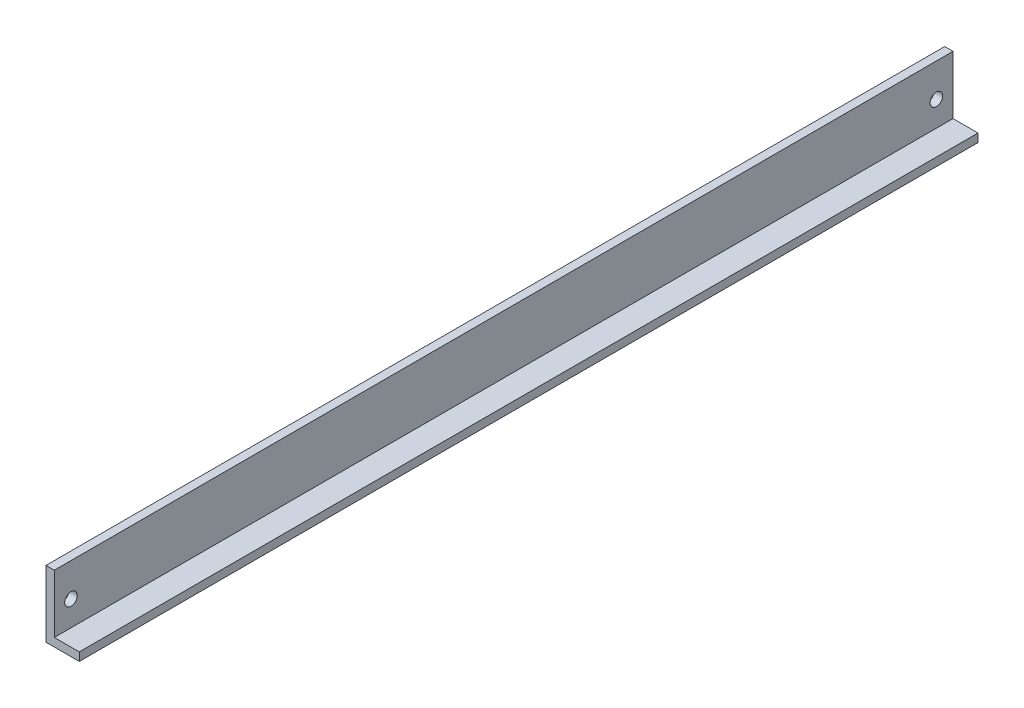
ISO-10303-21;
HEADER;
FILE_DESCRIPTION(('STEP AP214'),'2;1');
FILE_NAME('part.step','',(''),(''),'','','');
FILE_SCHEMA(('AUTOMOTIVE_DESIGN { 1 0 10303 214 1 1 1 1 }'));
ENDSEC;
DATA;
#1=APPLICATION_CONTEXT('core data for automotive mechanical design processes');
#2=APPLICATION_PROTOCOL_DEFINITION('international standard','automotive_design',2000,#1);
#3=PRODUCT_CONTEXT('',#1,'mechanical');
#4=PRODUCT('Part','Part','',(#3));
#5=PRODUCT_RELATED_PRODUCT_CATEGORY('part','',(#4));
#6=PRODUCT_DEFINITION_FORMATION('','',#4);
#7=PRODUCT_DEFINITION_CONTEXT('part definition',#1,'design');
#8=PRODUCT_DEFINITION('design','',#6,#7);
#9=PRODUCT_DEFINITION_SHAPE('','',#8);
#10=(LENGTH_UNIT() NAMED_UNIT(*) SI_UNIT(.MILLI.,.METRE.));
#11=(NAMED_UNIT(*) PLANE_ANGLE_UNIT() SI_UNIT($,.RADIAN.));
#12=(NAMED_UNIT(*) SI_UNIT($,.STERADIAN.) SOLID_ANGLE_UNIT());
#13=UNCERTAINTY_MEASURE_WITH_UNIT(LENGTH_MEASURE(1.E-05),#10,'distance_accuracy_value','');
#14=(GEOMETRIC_REPRESENTATION_CONTEXT(3) GLOBAL_UNCERTAINTY_ASSIGNED_CONTEXT((#13)) GLOBAL_UNIT_ASSIGNED_CONTEXT((#10,
#11,#12)) REPRESENTATION_CONTEXT('',''));
#15=CARTESIAN_POINT('',(0.,0.,0.));
#16=DIRECTION('',(0.,0.,1.));
#17=DIRECTION('',(1.,0.,0.));
#18=AXIS2_PLACEMENT_3D('',#15,#16,#17);
#19=CARTESIAN_POINT('',(3.175,25.4,342.9));
#20=DIRECTION('',(-1.,0.,0.));
#21=DIRECTION('',(0.,-1.,0.));
#22=AXIS2_PLACEMENT_3D('',#19,#20,#21);
#23=PLANE('',#22);
#24=DIRECTION('',(0.,0.,1.));
#25=VECTOR('',#24,1.);
#26=CARTESIAN_POINT('',(3.175,25.4,342.9));
#27=LINE('',#26,#25);
#28=CARTESIAN_POINT('',(3.175,25.4,0.));
#29=VERTEX_POINT('',#28);
#30=CARTESIAN_POINT('',(3.175,25.4,342.9));
#31=VERTEX_POINT('',#30);
#32=EDGE_CURVE('E74',#29,#31,#27,.T.);
#33=ORIENTED_EDGE('',*,*,#32,.T.);
#34=DIRECTION('',(0.,1.,0.));
#35=VECTOR('',#34,1.);
#36=CARTESIAN_POINT('',(3.175,0.,342.9));
#37=LINE('',#36,#35);
#38=CARTESIAN_POINT('',(3.175,3.175,342.9));
#39=VERTEX_POINT('',#38);
#40=EDGE_CURVE('E77',#31,#39,#37,.F.);
#41=ORIENTED_EDGE('',*,*,#40,.T.);
#42=DIRECTION('',(0.,0.,-1.));
#43=VECTOR('',#42,1.);
#44=CARTESIAN_POINT('',(3.175,3.175,342.9));
#45=LINE('',#44,#43);
#46=CARTESIAN_POINT('',(3.175,3.175,0.));
#47=VERTEX_POINT('',#46);
#48=EDGE_CURVE('E68',#39,#47,#45,.T.);
#49=ORIENTED_EDGE('',*,*,#48,.T.);
#50=DIRECTION('',(0.,1.,0.));
#51=VECTOR('',#50,1.);
#52=CARTESIAN_POINT('',(3.175,0.,0.));
#53=LINE('',#52,#51);
#54=EDGE_CURVE('E78',#29,#47,#53,.F.);
#55=ORIENTED_EDGE('',*,*,#54,.F.);
#56=EDGE_LOOP('',(#33,#41,#49,#55));
#57=FACE_BOUND('',#56,.T.);
#58=CARTESIAN_POINT('',(3.17499999999998,12.7,6.35000000000002));
#59=DIRECTION('',(-1.,0.,0.));
#60=DIRECTION('',(0.,-1.,0.));
#61=AXIS2_PLACEMENT_3D('',#58,#59,#60);
#62=CIRCLE('',#61,2.4003);
#63=CARTESIAN_POINT('',(3.17499999999998,10.2997,6.35000000000002));
#64=VERTEX_POINT('',#63);
#65=EDGE_CURVE('E84',#64,#64,#62,.T.);
#66=ORIENTED_EDGE('',*,*,#65,.T.);
#67=EDGE_LOOP('',(#66));
#68=FACE_BOUND('',#67,.T.);
#69=CARTESIAN_POINT('',(3.17499999999998,12.7,336.55));
#70=DIRECTION('',(-1.,0.,0.));
#71=DIRECTION('',(0.,-1.,0.));
#72=AXIS2_PLACEMENT_3D('',#69,#70,#71);
#73=CIRCLE('',#72,2.40030000000002);
#74=CARTESIAN_POINT('',(3.17499999999998,10.2997,336.55));
#75=VERTEX_POINT('',#74);
#76=EDGE_CURVE('E20',#75,#75,#73,.T.);
#77=ORIENTED_EDGE('',*,*,#76,.T.);
#78=EDGE_LOOP('',(#77));
#79=FACE_BOUND('',#78,.T.);
#80=ADVANCED_FACE('F17',(#57,#68,#79),#23,.F.);
#81=CARTESIAN_POINT('',(3.175,3.175,342.9));
#82=DIRECTION('',(0.,-1.,0.));
#83=DIRECTION('',(0.,0.,-1.));
#84=AXIS2_PLACEMENT_3D('',#81,#82,#83);
#85=PLANE('',#84);
#86=ORIENTED_EDGE('',*,*,#48,.F.);
#87=DIRECTION('',(-1.,0.,0.));
#88=VECTOR('',#87,1.);
#89=CARTESIAN_POINT('',(0.,3.175,342.9));
#90=LINE('',#89,#88);
#91=CARTESIAN_POINT('',(12.7,3.175,342.9));
#92=VERTEX_POINT('',#91);
#93=EDGE_CURVE('E91',#39,#92,#90,.F.);
#94=ORIENTED_EDGE('',*,*,#93,.T.);
#95=DIRECTION('',(0.,0.,1.));
#96=VECTOR('',#95,1.);
#97=CARTESIAN_POINT('',(12.7,3.175,342.9));
#98=LINE('',#97,#96);
#99=CARTESIAN_POINT('',(12.7,3.175,0.));
#100=VERTEX_POINT('',#99);
#101=EDGE_CURVE('E99',#92,#100,#98,.F.);
#102=ORIENTED_EDGE('',*,*,#101,.T.);
#103=DIRECTION('',(-1.,0.,0.));
#104=VECTOR('',#103,1.);
#105=CARTESIAN_POINT('',(0.,3.175,0.));
#106=LINE('',#105,#104);
#107=EDGE_CURVE('E231',#47,#100,#106,.F.);
#108=ORIENTED_EDGE('',*,*,#107,.F.);
#109=EDGE_LOOP('',(#86,#94,#102,#108));
#110=FACE_BOUND('',#109,.T.);
#111=ADVANCED_FACE('F148',(#110),#85,.F.);
#112=CARTESIAN_POINT('',(12.7,3.175,342.9));
#113=DIRECTION('',(-1.,0.,0.));
#114=DIRECTION('',(0.,0.,1.));
#115=AXIS2_PLACEMENT_3D('',#112,#113,#114);
#116=PLANE('',#115);
#117=ORIENTED_EDGE('',*,*,#101,.F.);
#118=DIRECTION('',(0.,1.,0.));
#119=VECTOR('',#118,1.);
#120=CARTESIAN_POINT('',(12.7,0.,342.9));
#121=LINE('',#120,#119);
#122=CARTESIAN_POINT('',(12.7,0.,342.9));
#123=VERTEX_POINT('',#122);
#124=EDGE_CURVE('E218',#92,#123,#121,.F.);
#125=ORIENTED_EDGE('',*,*,#124,.T.);
#126=DIRECTION('',(0.,0.,1.));
#127=VECTOR('',#126,1.);
#128=CARTESIAN_POINT('',(12.7,0.,342.9));
#129=LINE('',#128,#127);
#130=CARTESIAN_POINT('',(12.7,0.,0.));
#131=VERTEX_POINT('',#130);
#132=EDGE_CURVE('E225',#123,#131,#129,.F.);
#133=ORIENTED_EDGE('',*,*,#132,.T.);
#134=DIRECTION('',(0.,1.,0.));
#135=VECTOR('',#134,1.);
#136=CARTESIAN_POINT('',(12.7,0.,0.));
#137=LINE('',#136,#135);
#138=EDGE_CURVE('E108',#100,#131,#137,.F.);
#139=ORIENTED_EDGE('',*,*,#138,.F.);
#140=EDGE_LOOP('',(#117,#125,#133,#139));
#141=FACE_BOUND('',#140,.T.);
#142=ADVANCED_FACE('F119',(#141),#116,.F.);
#143=CARTESIAN_POINT('',(330.2,12.7000000000001,336.55));
#144=DIRECTION('',(-1.,0.,0.));
#145=DIRECTION('',(0.,-1.,0.));
#146=AXIS2_PLACEMENT_3D('',#143,#144,#145);
#147=CYLINDRICAL_SURFACE('',#146,2.40030000000002);
#148=ORIENTED_EDGE('',*,*,#76,.F.);
#149=EDGE_LOOP('',(#148));
#150=FACE_BOUND('',#149,.T.);
#151=CARTESIAN_POINT('',(0.,12.7,336.55));
#152=DIRECTION('',(-1.,0.,0.));
#153=DIRECTION('',(0.,-1.,0.));
#154=AXIS2_PLACEMENT_3D('',#151,#152,#153);
#155=CIRCLE('',#154,2.40030000000002);
#156=CARTESIAN_POINT('',(0.,10.2997,336.55));
#157=VERTEX_POINT('',#156);
#158=EDGE_CURVE('E106',#157,#157,#155,.T.);
#159=ORIENTED_EDGE('',*,*,#158,.T.);
#160=EDGE_LOOP('',(#159));
#161=FACE_BOUND('',#160,.T.);
#162=ADVANCED_FACE('F115',(#150,#161),#147,.F.);
#163=CARTESIAN_POINT('',(330.2,12.7000000000001,6.35000000000002));
#164=DIRECTION('',(-1.,0.,0.));
#165=DIRECTION('',(0.,-1.,0.));
#166=AXIS2_PLACEMENT_3D('',#163,#164,#165);
#167=CYLINDRICAL_SURFACE('',#166,2.4003);
#168=ORIENTED_EDGE('',*,*,#65,.F.);
#169=EDGE_LOOP('',(#168));
#170=FACE_BOUND('',#169,.T.);
#171=CARTESIAN_POINT('',(0.,12.7,6.35000000000002));
#172=DIRECTION('',(-1.,0.,0.));
#173=DIRECTION('',(0.,-1.,0.));
#174=AXIS2_PLACEMENT_3D('',#171,#172,#173);
#175=CIRCLE('',#174,2.4003);
#176=CARTESIAN_POINT('',(0.,10.2997,6.35000000000002));
#177=VERTEX_POINT('',#176);
#178=EDGE_CURVE('E103',#177,#177,#175,.T.);
#179=ORIENTED_EDGE('',*,*,#178,.T.);
#180=EDGE_LOOP('',(#179));
#181=FACE_BOUND('',#180,.T.);
#182=ADVANCED_FACE('F118',(#170,#181),#167,.F.);
#183=CARTESIAN_POINT('',(0.,25.4,342.9));
#184=DIRECTION('',(0.,-1.,0.));
#185=DIRECTION('',(1.,0.,0.));
#186=AXIS2_PLACEMENT_3D('',#183,#184,#185);
#187=PLANE('',#186);
#188=DIRECTION('',(0.,0.,1.));
#189=VECTOR('',#188,1.);
#190=CARTESIAN_POINT('',(0.,25.4,342.9));
#191=LINE('',#190,#189);
#192=CARTESIAN_POINT('',(0.,25.4,0.));
#193=VERTEX_POINT('',#192);
#194=CARTESIAN_POINT('',(0.,25.4,342.9));
#195=VERTEX_POINT('',#194);
#196=EDGE_CURVE('E95',#193,#195,#191,.T.);
#197=ORIENTED_EDGE('',*,*,#196,.T.);
#198=DIRECTION('',(-1.,0.,0.));
#199=VECTOR('',#198,1.);
#200=CARTESIAN_POINT('',(0.,25.4,342.9));
#201=LINE('',#200,#199);
#202=EDGE_CURVE('E83',#195,#31,#201,.F.);
#203=ORIENTED_EDGE('',*,*,#202,.T.);
#204=ORIENTED_EDGE('',*,*,#32,.F.);
#205=DIRECTION('',(-1.,0.,0.));
#206=VECTOR('',#205,1.);
#207=CARTESIAN_POINT('',(0.,25.4,0.));
#208=LINE('',#207,#206);
#209=EDGE_CURVE('E228',#193,#29,#208,.F.);
#210=ORIENTED_EDGE('',*,*,#209,.F.);
#211=EDGE_LOOP('',(#197,#203,#204,#210));
#212=FACE_BOUND('',#211,.T.);
#213=ADVANCED_FACE('F94',(#212),#187,.F.);
#214=CARTESIAN_POINT('',(0.,0.,342.9));
#215=DIRECTION('',(0.,0.,-1.));
#216=DIRECTION('',(-1.,0.,0.));
#217=AXIS2_PLACEMENT_3D('',#214,#215,#216);
#218=PLANE('',#217);
#219=ORIENTED_EDGE('',*,*,#124,.F.);
#220=ORIENTED_EDGE('',*,*,#93,.F.);
#221=ORIENTED_EDGE('',*,*,#40,.F.);
#222=ORIENTED_EDGE('',*,*,#202,.F.);
#223=DIRECTION('',(0.,1.,0.));
#224=VECTOR('',#223,1.);
#225=CARTESIAN_POINT('',(0.,0.,342.9));
#226=LINE('',#225,#224);
#227=CARTESIAN_POINT('',(0.,0.,342.9));
#228=VERTEX_POINT('',#227);
#229=EDGE_CURVE('E235',#195,#228,#226,.F.);
#230=ORIENTED_EDGE('',*,*,#229,.T.);
#231=DIRECTION('',(-1.,0.,0.));
#232=VECTOR('',#231,1.);
#233=CARTESIAN_POINT('',(12.7,0.,342.9));
#234=LINE('',#233,#232);
#235=EDGE_CURVE('E221',#228,#123,#234,.F.);
#236=ORIENTED_EDGE('',*,*,#235,.T.);
#237=EDGE_LOOP('',(#219,#220,#221,#222,#230,#236));
#238=FACE_BOUND('',#237,.T.);
#239=ADVANCED_FACE('F88',(#238),#218,.F.);
#240=CARTESIAN_POINT('',(12.7,0.,342.9));
#241=DIRECTION('',(0.,1.,0.));
#242=DIRECTION('',(-1.,0.,0.));
#243=AXIS2_PLACEMENT_3D('',#240,#241,#242);
#244=PLANE('',#243);
#245=ORIENTED_EDGE('',*,*,#132,.F.);
#246=ORIENTED_EDGE('',*,*,#235,.F.);
#247=DIRECTION('',(0.,0.,1.));
#248=VECTOR('',#247,1.);
#249=CARTESIAN_POINT('',(0.,0.,342.9));
#250=LINE('',#249,#248);
#251=CARTESIAN_POINT('',(0.,0.,0.));
#252=VERTEX_POINT('',#251);
#253=EDGE_CURVE('E26',#228,#252,#250,.F.);
#254=ORIENTED_EDGE('',*,*,#253,.T.);
#255=DIRECTION('',(-1.,0.,0.));
#256=VECTOR('',#255,1.);
#257=CARTESIAN_POINT('',(0.,0.,0.));
#258=LINE('',#257,#256);
#259=EDGE_CURVE('E34',#131,#252,#258,.T.);
#260=ORIENTED_EDGE('',*,*,#259,.F.);
#261=EDGE_LOOP('',(#245,#246,#254,#260));
#262=FACE_BOUND('',#261,.T.);
#263=ADVANCED_FACE('F132',(#262),#244,.F.);
#264=CARTESIAN_POINT('',(0.,0.,0.));
#265=DIRECTION('',(0.,0.,-1.));
#266=DIRECTION('',(-1.,0.,0.));
#267=AXIS2_PLACEMENT_3D('',#264,#265,#266);
#268=PLANE('',#267);
#269=ORIENTED_EDGE('',*,*,#107,.T.);
#270=ORIENTED_EDGE('',*,*,#138,.T.);
#271=ORIENTED_EDGE('',*,*,#259,.T.);
#272=DIRECTION('',(0.,1.,0.));
#273=VECTOR('',#272,1.);
#274=CARTESIAN_POINT('',(0.,0.,0.));
#275=LINE('',#274,#273);
#276=EDGE_CURVE('E11',#252,#193,#275,.T.);
#277=ORIENTED_EDGE('',*,*,#276,.T.);
#278=ORIENTED_EDGE('',*,*,#209,.T.);
#279=ORIENTED_EDGE('',*,*,#54,.T.);
#280=EDGE_LOOP('',(#269,#270,#271,#277,#278,#279));
#281=FACE_BOUND('',#280,.T.);
#282=ADVANCED_FACE('F125',(#281),#268,.T.);
#283=CARTESIAN_POINT('',(0.,0.,342.9));
#284=DIRECTION('',(1.,0.,0.));
#285=DIRECTION('',(0.,1.,0.));
#286=AXIS2_PLACEMENT_3D('',#283,#284,#285);
#287=PLANE('',#286);
#288=ORIENTED_EDGE('',*,*,#253,.F.);
#289=ORIENTED_EDGE('',*,*,#229,.F.);
#290=ORIENTED_EDGE('',*,*,#196,.F.);
#291=ORIENTED_EDGE('',*,*,#276,.F.);
#292=EDGE_LOOP('',(#288,#289,#290,#291));
#293=FACE_BOUND('',#292,.T.);
#294=ORIENTED_EDGE('',*,*,#178,.F.);
#295=EDGE_LOOP('',(#294));
#296=FACE_BOUND('',#295,.T.);
#297=ORIENTED_EDGE('',*,*,#158,.F.);
#298=EDGE_LOOP('',(#297));
#299=FACE_BOUND('',#298,.T.);
#300=ADVANCED_FACE('F123',(#293,#296,#299),#287,.F.);
#301=CLOSED_SHELL('',(#80,#111,#142,#162,#182,#213,#239,#263,#282,#300));
#302=MANIFOLD_SOLID_BREP('B1',#301);
#303=ADVANCED_BREP_SHAPE_REPRESENTATION('',(#18,#302),#14);
#304=SHAPE_DEFINITION_REPRESENTATION(#9,#303);
ENDSEC;
END-ISO-10303-21;
